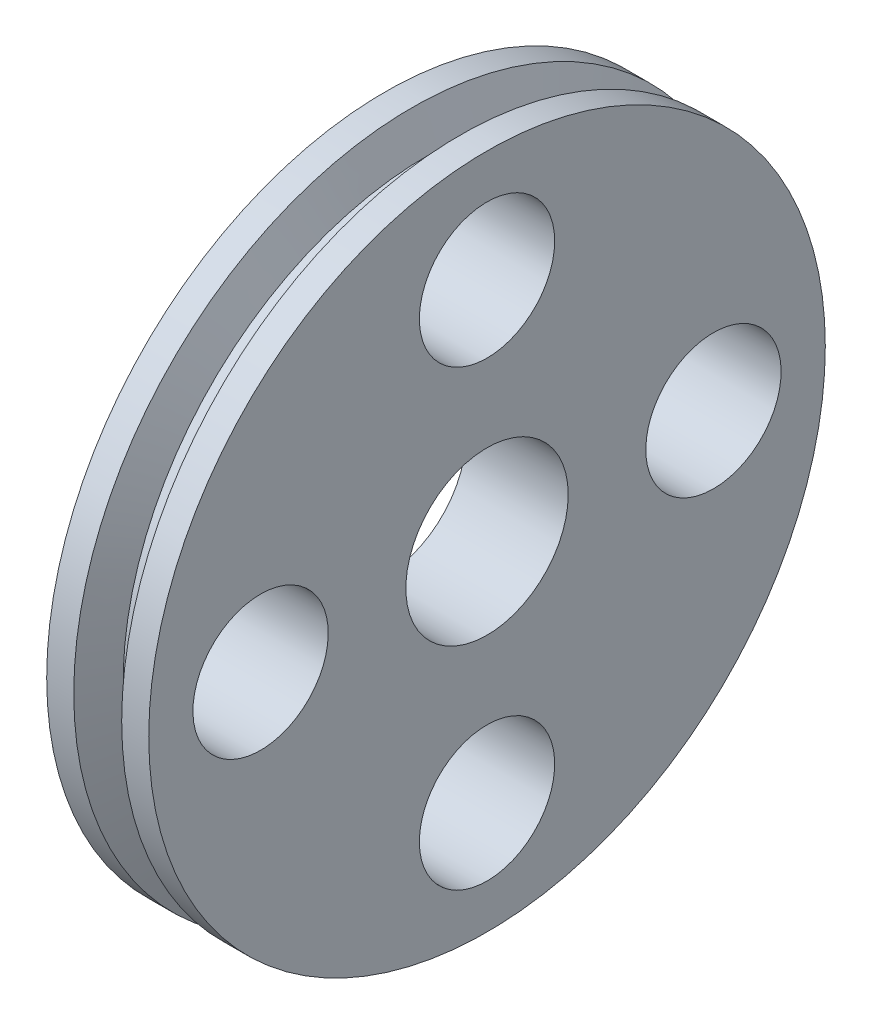
ISO-10303-21;
HEADER;
FILE_DESCRIPTION(('STEP AP214'),'2;1');
FILE_NAME('part.step','',(''),(''),'','','');
FILE_SCHEMA(('AUTOMOTIVE_DESIGN { 1 0 10303 214 1 1 1 1 }'));
ENDSEC;
DATA;
#1=APPLICATION_CONTEXT('core data for automotive mechanical design processes');
#2=APPLICATION_PROTOCOL_DEFINITION('international standard','automotive_design',2000,#1);
#3=PRODUCT_CONTEXT('',#1,'mechanical');
#4=PRODUCT('Part','Part','',(#3));
#5=PRODUCT_RELATED_PRODUCT_CATEGORY('part','',(#4));
#6=PRODUCT_DEFINITION_FORMATION('','',#4);
#7=PRODUCT_DEFINITION_CONTEXT('part definition',#1,'design');
#8=PRODUCT_DEFINITION('design','',#6,#7);
#9=PRODUCT_DEFINITION_SHAPE('','',#8);
#10=(LENGTH_UNIT() NAMED_UNIT(*) SI_UNIT(.MILLI.,.METRE.));
#11=(NAMED_UNIT(*) PLANE_ANGLE_UNIT() SI_UNIT($,.RADIAN.));
#12=(NAMED_UNIT(*) SI_UNIT($,.STERADIAN.) SOLID_ANGLE_UNIT());
#13=UNCERTAINTY_MEASURE_WITH_UNIT(LENGTH_MEASURE(1.E-05),#10,'distance_accuracy_value','');
#14=(GEOMETRIC_REPRESENTATION_CONTEXT(3) GLOBAL_UNCERTAINTY_ASSIGNED_CONTEXT((#13)) GLOBAL_UNIT_ASSIGNED_CONTEXT((#10,
#11,#12)) REPRESENTATION_CONTEXT('',''));
#15=CARTESIAN_POINT('',(0.,0.,0.));
#16=DIRECTION('',(0.,0.,1.));
#17=DIRECTION('',(1.,0.,0.));
#18=AXIS2_PLACEMENT_3D('',#15,#16,#17);
#19=CARTESIAN_POINT('',(-20.8548588039868,100.,0.));
#20=DIRECTION('',(1.,0.,0.));
#21=DIRECTION('',(0.,0.,-1.));
#22=AXIS2_PLACEMENT_3D('',#19,#20,#21);
#23=PLANE('',#22);
#24=CARTESIAN_POINT('',(-20.8548588039868,-2.33708792818174E-13,66.9368586388066));
#25=DIRECTION('',(1.,0.,0.));
#26=DIRECTION('',(0.,1.,0.));
#27=AXIS2_PLACEMENT_3D('',#24,#25,#26);
#28=CIRCLE('',#27,20.);
#29=CARTESIAN_POINT('',(-20.8548588039868,19.9999999999998,66.9368586388067));
#30=VERTEX_POINT('',#29);
#31=EDGE_CURVE('E60',#30,#30,#28,.T.);
#32=ORIENTED_EDGE('',*,*,#31,.F.);
#33=EDGE_LOOP('',(#32));
#34=FACE_BOUND('',#33,.T.);
#35=CARTESIAN_POINT('',(-20.8548588039868,-66.9368586388066,0.));
#36=DIRECTION('',(1.,0.,0.));
#37=DIRECTION('',(0.,0.,1.));
#38=AXIS2_PLACEMENT_3D('',#35,#36,#37);
#39=CIRCLE('',#38,20.);
#40=CARTESIAN_POINT('',(-20.8548588039868,-66.9368586388066,20.));
#41=VERTEX_POINT('',#40);
#42=EDGE_CURVE('E115',#41,#41,#39,.T.);
#43=ORIENTED_EDGE('',*,*,#42,.F.);
#44=EDGE_LOOP('',(#43));
#45=FACE_BOUND('',#44,.T.);
#46=CARTESIAN_POINT('',(-20.8548588039868,7.01126378454522E-13,-66.9368586388066));
#47=DIRECTION('',(1.,0.,0.));
#48=DIRECTION('',(0.,-1.,0.));
#49=AXIS2_PLACEMENT_3D('',#46,#47,#48);
#50=CIRCLE('',#49,20.);
#51=CARTESIAN_POINT('',(-20.8548588039868,-19.9999999999993,-66.9368586388068));
#52=VERTEX_POINT('',#51);
#53=EDGE_CURVE('E73',#52,#52,#50,.T.);
#54=ORIENTED_EDGE('',*,*,#53,.F.);
#55=EDGE_LOOP('',(#54));
#56=FACE_BOUND('',#55,.T.);
#57=CARTESIAN_POINT('',(-20.8548588039868,66.9368586388066,0.));
#58=DIRECTION('',(1.,0.,0.));
#59=DIRECTION('',(0.,0.,-1.));
#60=AXIS2_PLACEMENT_3D('',#57,#58,#59);
#61=CIRCLE('',#60,20.);
#62=CARTESIAN_POINT('',(-20.8548588039868,66.9368586388066,-20.));
#63=VERTEX_POINT('',#62);
#64=EDGE_CURVE('E56',#63,#63,#61,.T.);
#65=ORIENTED_EDGE('',*,*,#64,.F.);
#66=EDGE_LOOP('',(#65));
#67=FACE_BOUND('',#66,.T.);
#68=CARTESIAN_POINT('',(-20.8548588039867,0.,0.));
#69=DIRECTION('',(1.,0.,0.));
#70=DIRECTION('',(0.,0.,-1.));
#71=AXIS2_PLACEMENT_3D('',#68,#69,#70);
#72=CIRCLE('',#71,100.);
#73=CARTESIAN_POINT('',(-20.8548588039867,0.,-100.));
#74=VERTEX_POINT('',#73);
#75=EDGE_CURVE('E55',#74,#74,#72,.T.);
#76=ORIENTED_EDGE('',*,*,#75,.T.);
#77=EDGE_LOOP('',(#76));
#78=FACE_BOUND('',#77,.T.);
#79=CARTESIAN_POINT('',(-20.8548588039868,0.,0.));
#80=DIRECTION('',(1.,0.,0.));
#81=DIRECTION('',(0.,0.,-1.));
#82=AXIS2_PLACEMENT_3D('',#79,#80,#81);
#83=CIRCLE('',#82,24.);
#84=CARTESIAN_POINT('',(-20.8548588039868,0.,-24.));
#85=VERTEX_POINT('',#84);
#86=EDGE_CURVE('E10',#85,#85,#83,.T.);
#87=ORIENTED_EDGE('',*,*,#86,.F.);
#88=EDGE_LOOP('',(#87));
#89=FACE_BOUND('',#88,.T.);
#90=ADVANCED_FACE('F36',(#34,#45,#56,#67,#78,#89),#23,.T.);
#91=CARTESIAN_POINT('',(0.,0.,0.));
#92=DIRECTION('',(1.,0.,0.));
#93=DIRECTION('',(0.,0.,-1.));
#94=AXIS2_PLACEMENT_3D('',#91,#92,#93);
#95=CYLINDRICAL_SURFACE('',#94,24.);
#96=ORIENTED_EDGE('',*,*,#86,.T.);
#97=EDGE_LOOP('',(#96));
#98=FACE_BOUND('',#97,.T.);
#99=CARTESIAN_POINT('',(-51.0215254706534,0.,0.));
#100=DIRECTION('',(1.,0.,0.));
#101=DIRECTION('',(0.,0.,-1.));
#102=AXIS2_PLACEMENT_3D('',#99,#100,#101);
#103=CIRCLE('',#102,24.);
#104=CARTESIAN_POINT('',(-51.0215254706534,0.,-24.));
#105=VERTEX_POINT('',#104);
#106=EDGE_CURVE('E43',#105,#105,#103,.T.);
#107=ORIENTED_EDGE('',*,*,#106,.F.);
#108=EDGE_LOOP('',(#107));
#109=FACE_BOUND('',#108,.T.);
#110=ADVANCED_FACE('F96',(#98,#109),#95,.F.);
#111=CARTESIAN_POINT('',(-51.0215254706534,24.,0.));
#112=DIRECTION('',(-1.,0.,0.));
#113=DIRECTION('',(0.,0.,1.));
#114=AXIS2_PLACEMENT_3D('',#111,#112,#113);
#115=PLANE('',#114);
#116=CARTESIAN_POINT('',(-51.0215254706534,-2.33708792818174E-13,66.9368586388066));
#117=DIRECTION('',(-1.,0.,0.));
#118=DIRECTION('',(0.,0.,1.));
#119=AXIS2_PLACEMENT_3D('',#116,#117,#118);
#120=CIRCLE('',#119,20.);
#121=CARTESIAN_POINT('',(-51.0215254706534,-2.33708792818174E-13,86.9368586388066));
#122=VERTEX_POINT('',#121);
#123=EDGE_CURVE('E39',#122,#122,#120,.T.);
#124=ORIENTED_EDGE('',*,*,#123,.F.);
#125=EDGE_LOOP('',(#124));
#126=FACE_BOUND('',#125,.T.);
#127=CARTESIAN_POINT('',(-51.0215254706534,-66.9368586388066,0.));
#128=DIRECTION('',(-1.,0.,0.));
#129=DIRECTION('',(0.,0.,1.));
#130=AXIS2_PLACEMENT_3D('',#127,#128,#129);
#131=CIRCLE('',#130,20.);
#132=CARTESIAN_POINT('',(-51.0215254706534,-66.9368586388066,20.));
#133=VERTEX_POINT('',#132);
#134=EDGE_CURVE('E59',#133,#133,#131,.T.);
#135=ORIENTED_EDGE('',*,*,#134,.F.);
#136=EDGE_LOOP('',(#135));
#137=FACE_BOUND('',#136,.T.);
#138=CARTESIAN_POINT('',(-51.0215254706534,7.01126378454522E-13,-66.9368586388066));
#139=DIRECTION('',(-1.,0.,0.));
#140=DIRECTION('',(0.,0.,1.));
#141=AXIS2_PLACEMENT_3D('',#138,#139,#140);
#142=CIRCLE('',#141,20.);
#143=CARTESIAN_POINT('',(-51.0215254706534,7.01126378454522E-13,-46.9368586388066));
#144=VERTEX_POINT('',#143);
#145=EDGE_CURVE('E57',#144,#144,#142,.T.);
#146=ORIENTED_EDGE('',*,*,#145,.F.);
#147=EDGE_LOOP('',(#146));
#148=FACE_BOUND('',#147,.T.);
#149=CARTESIAN_POINT('',(-51.0215254706534,66.9368586388066,0.));
#150=DIRECTION('',(-1.,0.,0.));
#151=DIRECTION('',(0.,0.,1.));
#152=AXIS2_PLACEMENT_3D('',#149,#150,#151);
#153=CIRCLE('',#152,20.);
#154=CARTESIAN_POINT('',(-51.0215254706534,66.9368586388066,20.));
#155=VERTEX_POINT('',#154);
#156=EDGE_CURVE('E52',#155,#155,#153,.T.);
#157=ORIENTED_EDGE('',*,*,#156,.F.);
#158=EDGE_LOOP('',(#157));
#159=FACE_BOUND('',#158,.T.);
#160=ORIENTED_EDGE('',*,*,#106,.T.);
#161=EDGE_LOOP('',(#160));
#162=FACE_BOUND('',#161,.T.);
#163=CARTESIAN_POINT('',(-51.0215254706533,0.,0.));
#164=DIRECTION('',(1.,0.,0.));
#165=DIRECTION('',(0.,0.,-1.));
#166=AXIS2_PLACEMENT_3D('',#163,#164,#165);
#167=CIRCLE('',#166,100.);
#168=CARTESIAN_POINT('',(-51.0215254706533,0.,-100.));
#169=VERTEX_POINT('',#168);
#170=EDGE_CURVE('E48',#169,#169,#167,.T.);
#171=ORIENTED_EDGE('',*,*,#170,.F.);
#172=EDGE_LOOP('',(#171));
#173=FACE_BOUND('',#172,.T.);
#174=ADVANCED_FACE('F94',(#126,#137,#148,#159,#162,#173),#115,.T.);
#175=CARTESIAN_POINT('',(0.,0.,0.));
#176=DIRECTION('',(1.,0.,0.));
#177=DIRECTION('',(0.,0.,-1.));
#178=AXIS2_PLACEMENT_3D('',#175,#176,#177);
#179=CYLINDRICAL_SURFACE('',#178,100.);
#180=ORIENTED_EDGE('',*,*,#170,.T.);
#181=EDGE_LOOP('',(#180));
#182=FACE_BOUND('',#181,.T.);
#183=CARTESIAN_POINT('',(-43.0215254706533,0.,0.));
#184=DIRECTION('',(1.,0.,0.));
#185=DIRECTION('',(0.,0.,-1.));
#186=AXIS2_PLACEMENT_3D('',#183,#184,#185);
#187=CIRCLE('',#186,100.);
#188=CARTESIAN_POINT('',(-43.0215254706533,0.,-100.));
#189=VERTEX_POINT('',#188);
#190=EDGE_CURVE('E86',#189,#189,#187,.T.);
#191=ORIENTED_EDGE('',*,*,#190,.F.);
#192=EDGE_LOOP('',(#191));
#193=FACE_BOUND('',#192,.T.);
#194=ADVANCED_FACE('F91',(#182,#193),#179,.T.);
#195=CARTESIAN_POINT('',(-38.43819213732,0.,0.));
#196=DIRECTION('',(-1.,0.,0.));
#197=DIRECTION('',(0.,0.,1.));
#198=AXIS2_PLACEMENT_3D('',#195,#196,#197);
#199=CONICAL_SURFACE('',#198,90.,1.14103404769821);
#200=ORIENTED_EDGE('',*,*,#190,.T.);
#201=EDGE_LOOP('',(#200));
#202=FACE_BOUND('',#201,.T.);
#203=CARTESIAN_POINT('',(-38.43819213732,0.,0.));
#204=DIRECTION('',(1.,0.,0.));
#205=DIRECTION('',(0.,0.,-1.));
#206=AXIS2_PLACEMENT_3D('',#203,#204,#205);
#207=CIRCLE('',#206,90.);
#208=CARTESIAN_POINT('',(-38.43819213732,0.,-90.));
#209=VERTEX_POINT('',#208);
#210=EDGE_CURVE('E83',#209,#209,#207,.T.);
#211=ORIENTED_EDGE('',*,*,#210,.F.);
#212=EDGE_LOOP('',(#211));
#213=FACE_BOUND('',#212,.T.);
#214=ADVANCED_FACE('F103',(#202,#213),#199,.T.);
#215=CARTESIAN_POINT('',(0.,0.,0.));
#216=DIRECTION('',(1.,0.,0.));
#217=DIRECTION('',(0.,0.,-1.));
#218=AXIS2_PLACEMENT_3D('',#215,#216,#217);
#219=CYLINDRICAL_SURFACE('',#218,90.);
#220=ORIENTED_EDGE('',*,*,#210,.T.);
#221=EDGE_LOOP('',(#220));
#222=FACE_BOUND('',#221,.T.);
#223=CARTESIAN_POINT('',(-33.43819213732,0.,0.));
#224=DIRECTION('',(1.,0.,0.));
#225=DIRECTION('',(0.,0.,-1.));
#226=AXIS2_PLACEMENT_3D('',#223,#224,#225);
#227=CIRCLE('',#226,90.);
#228=CARTESIAN_POINT('',(-33.43819213732,0.,-90.));
#229=VERTEX_POINT('',#228);
#230=EDGE_CURVE('E80',#229,#229,#227,.T.);
#231=ORIENTED_EDGE('',*,*,#230,.F.);
#232=EDGE_LOOP('',(#231));
#233=FACE_BOUND('',#232,.T.);
#234=ADVANCED_FACE('F136',(#222,#233),#219,.T.);
#235=CARTESIAN_POINT('',(-28.8548588039867,0.,0.));
#236=DIRECTION('',(1.,0.,0.));
#237=DIRECTION('',(0.,0.,-1.));
#238=AXIS2_PLACEMENT_3D('',#235,#236,#237);
#239=CONICAL_SURFACE('',#238,100.,1.14103404769821);
#240=ORIENTED_EDGE('',*,*,#230,.T.);
#241=EDGE_LOOP('',(#240));
#242=FACE_BOUND('',#241,.T.);
#243=CARTESIAN_POINT('',(-28.8548588039867,0.,0.));
#244=DIRECTION('',(1.,0.,0.));
#245=DIRECTION('',(0.,0.,-1.));
#246=AXIS2_PLACEMENT_3D('',#243,#244,#245);
#247=CIRCLE('',#246,100.);
#248=CARTESIAN_POINT('',(-28.8548588039867,0.,-100.));
#249=VERTEX_POINT('',#248);
#250=EDGE_CURVE('E77',#249,#249,#247,.T.);
#251=ORIENTED_EDGE('',*,*,#250,.F.);
#252=EDGE_LOOP('',(#251));
#253=FACE_BOUND('',#252,.T.);
#254=ADVANCED_FACE('F126',(#242,#253),#239,.T.);
#255=CARTESIAN_POINT('',(0.,0.,0.));
#256=DIRECTION('',(1.,0.,0.));
#257=DIRECTION('',(0.,0.,-1.));
#258=AXIS2_PLACEMENT_3D('',#255,#256,#257);
#259=CYLINDRICAL_SURFACE('',#258,100.);
#260=ORIENTED_EDGE('',*,*,#250,.T.);
#261=EDGE_LOOP('',(#260));
#262=FACE_BOUND('',#261,.T.);
#263=ORIENTED_EDGE('',*,*,#75,.F.);
#264=EDGE_LOOP('',(#263));
#265=FACE_BOUND('',#264,.T.);
#266=ADVANCED_FACE('F123',(#262,#265),#259,.T.);
#267=CARTESIAN_POINT('',(-123.854858803987,66.9368586388066,0.));
#268=DIRECTION('',(1.,0.,0.));
#269=DIRECTION('',(0.,0.,-1.));
#270=AXIS2_PLACEMENT_3D('',#267,#268,#269);
#271=CYLINDRICAL_SURFACE('',#270,20.);
#272=ORIENTED_EDGE('',*,*,#156,.T.);
#273=EDGE_LOOP('',(#272));
#274=FACE_BOUND('',#273,.T.);
#275=ORIENTED_EDGE('',*,*,#64,.T.);
#276=EDGE_LOOP('',(#275));
#277=FACE_BOUND('',#276,.T.);
#278=ADVANCED_FACE('F125',(#274,#277),#271,.F.);
#279=CARTESIAN_POINT('',(-123.854858803987,7.01126378454522E-13,-66.9368586388066));
#280=DIRECTION('',(1.,0.,0.));
#281=DIRECTION('',(0.,0.,-1.));
#282=AXIS2_PLACEMENT_3D('',#279,#280,#281);
#283=CYLINDRICAL_SURFACE('',#282,20.);
#284=ORIENTED_EDGE('',*,*,#145,.T.);
#285=EDGE_LOOP('',(#284));
#286=FACE_BOUND('',#285,.T.);
#287=ORIENTED_EDGE('',*,*,#53,.T.);
#288=EDGE_LOOP('',(#287));
#289=FACE_BOUND('',#288,.T.);
#290=ADVANCED_FACE('F133',(#286,#289),#283,.F.);
#291=CARTESIAN_POINT('',(-123.854858803987,-66.9368586388066,0.));
#292=DIRECTION('',(1.,0.,0.));
#293=DIRECTION('',(0.,0.,-1.));
#294=AXIS2_PLACEMENT_3D('',#291,#292,#293);
#295=CYLINDRICAL_SURFACE('',#294,20.);
#296=ORIENTED_EDGE('',*,*,#134,.T.);
#297=EDGE_LOOP('',(#296));
#298=FACE_BOUND('',#297,.T.);
#299=ORIENTED_EDGE('',*,*,#42,.T.);
#300=EDGE_LOOP('',(#299));
#301=FACE_BOUND('',#300,.T.);
#302=ADVANCED_FACE('F196',(#298,#301),#295,.F.);
#303=CARTESIAN_POINT('',(-123.854858803987,-2.33708792818174E-13,66.9368586388066));
#304=DIRECTION('',(1.,0.,0.));
#305=DIRECTION('',(0.,0.,-1.));
#306=AXIS2_PLACEMENT_3D('',#303,#304,#305);
#307=CYLINDRICAL_SURFACE('',#306,20.);
#308=ORIENTED_EDGE('',*,*,#123,.T.);
#309=EDGE_LOOP('',(#308));
#310=FACE_BOUND('',#309,.T.);
#311=ORIENTED_EDGE('',*,*,#31,.T.);
#312=EDGE_LOOP('',(#311));
#313=FACE_BOUND('',#312,.T.);
#314=ADVANCED_FACE('F205',(#310,#313),#307,.F.);
#315=CLOSED_SHELL('',(#90,#110,#174,#194,#214,#234,#254,#266,#278,#290,#302,#314));
#316=MANIFOLD_SOLID_BREP('B2',#315);
#317=ADVANCED_BREP_SHAPE_REPRESENTATION('',(#18,#316),#14);
#318=SHAPE_DEFINITION_REPRESENTATION(#9,#317);
ENDSEC;
END-ISO-10303-21;
